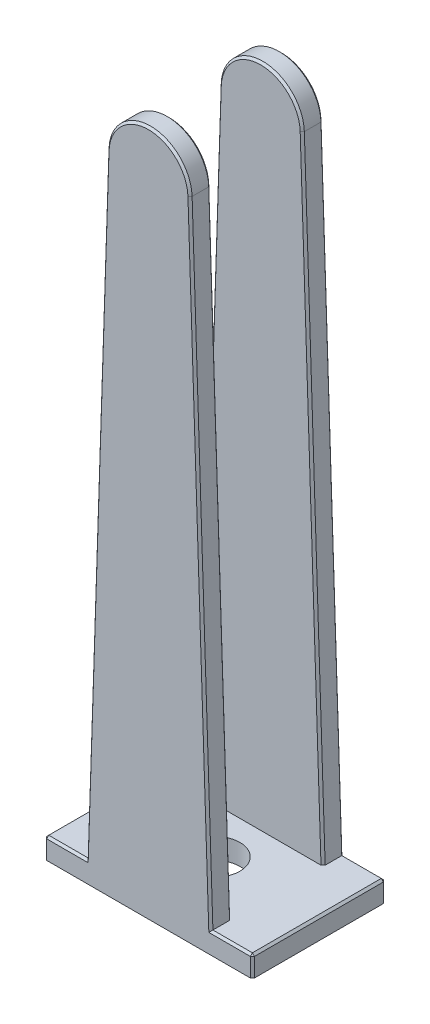
ISO-10303-21;
HEADER;
FILE_DESCRIPTION(('STEP AP214'),'2;1');
FILE_NAME('part.step','',(''),(''),'','','');
FILE_SCHEMA(('AUTOMOTIVE_DESIGN { 1 0 10303 214 1 1 1 1 }'));
ENDSEC;
DATA;
#1=APPLICATION_CONTEXT('core data for automotive mechanical design processes');
#2=APPLICATION_PROTOCOL_DEFINITION('international standard','automotive_design',2000,#1);
#3=PRODUCT_CONTEXT('',#1,'mechanical');
#4=PRODUCT('Part','Part','',(#3));
#5=PRODUCT_RELATED_PRODUCT_CATEGORY('part','',(#4));
#6=PRODUCT_DEFINITION_FORMATION('','',#4);
#7=PRODUCT_DEFINITION_CONTEXT('part definition',#1,'design');
#8=PRODUCT_DEFINITION('design','',#6,#7);
#9=PRODUCT_DEFINITION_SHAPE('','',#8);
#10=(LENGTH_UNIT() NAMED_UNIT(*) SI_UNIT(.MILLI.,.METRE.));
#11=(NAMED_UNIT(*) PLANE_ANGLE_UNIT() SI_UNIT($,.RADIAN.));
#12=(NAMED_UNIT(*) SI_UNIT($,.STERADIAN.) SOLID_ANGLE_UNIT());
#13=UNCERTAINTY_MEASURE_WITH_UNIT(LENGTH_MEASURE(1.E-05),#10,'distance_accuracy_value','');
#14=(GEOMETRIC_REPRESENTATION_CONTEXT(3) GLOBAL_UNCERTAINTY_ASSIGNED_CONTEXT((#13)) GLOBAL_UNIT_ASSIGNED_CONTEXT((#10,
#11,#12)) REPRESENTATION_CONTEXT('',''));
#15=CARTESIAN_POINT('',(0.,0.,0.));
#16=DIRECTION('',(0.,0.,1.));
#17=DIRECTION('',(1.,0.,0.));
#18=AXIS2_PLACEMENT_3D('',#15,#16,#17);
#19=CARTESIAN_POINT('',(0.,0.,0.));
#20=DIRECTION('',(0.,-1.,0.));
#21=DIRECTION('',(0.,0.,-1.));
#22=AXIS2_PLACEMENT_3D('',#19,#20,#21);
#23=PLANE('',#22);
#24=CARTESIAN_POINT('',(-15.,0.,16.));
#25=DIRECTION('',(0.,-1.,0.));
#26=DIRECTION('',(0.,0.,-1.));
#27=AXIS2_PLACEMENT_3D('',#24,#25,#26);
#28=CIRCLE('',#27,6.);
#29=CARTESIAN_POINT('',(-15.,0.,10.));
#30=VERTEX_POINT('',#29);
#31=EDGE_CURVE('E503',#30,#30,#28,.T.);
#32=ORIENTED_EDGE('',*,*,#31,.T.);
#33=EDGE_LOOP('',(#32));
#34=FACE_BOUND('',#33,.T.);
#35=DIRECTION('',(0.,0.,1.));
#36=VECTOR('',#35,1.);
#37=CARTESIAN_POINT('',(-39.5,0.,32.));
#38=LINE('',#37,#36);
#39=CARTESIAN_POINT('',(-39.5,0.,0.499999999999987));
#40=VERTEX_POINT('',#39);
#41=CARTESIAN_POINT('',(-39.5,0.,31.5));
#42=VERTEX_POINT('',#41);
#43=EDGE_CURVE('E275',#40,#42,#38,.T.);
#44=ORIENTED_EDGE('',*,*,#43,.T.);
#45=DIRECTION('',(1.,0.,0.));
#46=VECTOR('',#45,1.);
#47=CARTESIAN_POINT('',(-30.,0.,31.5));
#48=LINE('',#47,#46);
#49=CARTESIAN_POINT('',(-30.,0.,31.5));
#50=VERTEX_POINT('',#49);
#51=EDGE_CURVE('E278',#42,#50,#48,.T.);
#52=ORIENTED_EDGE('',*,*,#51,.T.);
#53=DIRECTION('',(0.,0.,1.));
#54=VECTOR('',#53,1.);
#55=CARTESIAN_POINT('',(-30.,0.,27.));
#56=LINE('',#55,#54);
#57=CARTESIAN_POINT('',(-30.,0.,27.5));
#58=VERTEX_POINT('',#57);
#59=EDGE_CURVE('E507',#58,#50,#56,.T.);
#60=ORIENTED_EDGE('',*,*,#59,.F.);
#61=DIRECTION('',(-0.707302628879884,0.,0.706910879234154));
#62=VECTOR('',#61,1.);
#63=CARTESIAN_POINT('',(-1.24169184557018,0.,-1.24237995542235));
#64=LINE('',#63,#62);
#65=CARTESIAN_POINT('',(-29.4997229144032,0.,27.));
#66=VERTEX_POINT('',#65);
#67=EDGE_CURVE('E51',#58,#66,#64,.F.);
#68=ORIENTED_EDGE('',*,*,#67,.T.);
#69=DIRECTION('',(1.,0.,0.));
#70=VECTOR('',#69,1.);
#71=CARTESIAN_POINT('',(0.,0.,27.));
#72=LINE('',#71,#70);
#73=CARTESIAN_POINT('',(-0.500277085596828,0.,27.));
#74=VERTEX_POINT('',#73);
#75=EDGE_CURVE('E496',#66,#74,#72,.T.);
#76=ORIENTED_EDGE('',*,*,#75,.T.);
#77=DIRECTION('',(-0.707302628879885,0.,-0.706910879234153));
#78=VECTOR('',#77,1.);
#79=CARTESIAN_POINT('',(-13.749997889818,0.,13.7576177425609));
#80=LINE('',#79,#78);
#81=CARTESIAN_POINT('',(0.,0.,27.5));
#82=VERTEX_POINT('',#81);
#83=EDGE_CURVE('E11',#74,#82,#80,.F.);
#84=ORIENTED_EDGE('',*,*,#83,.T.);
#85=DIRECTION('',(0.,0.,1.));
#86=VECTOR('',#85,1.);
#87=CARTESIAN_POINT('',(0.,0.,27.));
#88=LINE('',#87,#86);
#89=CARTESIAN_POINT('',(0.,0.,31.5));
#90=VERTEX_POINT('',#89);
#91=EDGE_CURVE('E502',#82,#90,#88,.T.);
#92=ORIENTED_EDGE('',*,*,#91,.T.);
#93=DIRECTION('',(1.,0.,0.));
#94=VECTOR('',#93,1.);
#95=CARTESIAN_POINT('',(10.,0.,31.5));
#96=LINE('',#95,#94);
#97=CARTESIAN_POINT('',(9.50000000000001,0.,31.5));
#98=VERTEX_POINT('',#97);
#99=EDGE_CURVE('E263',#90,#98,#96,.T.);
#100=ORIENTED_EDGE('',*,*,#99,.T.);
#101=DIRECTION('',(0.,0.,-1.));
#102=VECTOR('',#101,1.);
#103=CARTESIAN_POINT('',(9.50000000000001,0.,0.));
#104=LINE('',#103,#102);
#105=CARTESIAN_POINT('',(9.50000000000001,0.,0.499999999999993));
#106=VERTEX_POINT('',#105);
#107=EDGE_CURVE('E266',#98,#106,#104,.T.);
#108=ORIENTED_EDGE('',*,*,#107,.T.);
#109=DIRECTION('',(-1.,0.,0.));
#110=VECTOR('',#109,1.);
#111=CARTESIAN_POINT('',(0.,0.,0.499999999999993));
#112=LINE('',#111,#110);
#113=CARTESIAN_POINT('',(0.,0.,0.499999999999993));
#114=VERTEX_POINT('',#113);
#115=EDGE_CURVE('E269',#106,#114,#112,.T.);
#116=ORIENTED_EDGE('',*,*,#115,.T.);
#117=DIRECTION('',(0.,0.,-1.));
#118=VECTOR('',#117,1.);
#119=CARTESIAN_POINT('',(0.,0.,5.));
#120=LINE('',#119,#118);
#121=CARTESIAN_POINT('',(0.,0.,4.49999999999999));
#122=VERTEX_POINT('',#121);
#123=EDGE_CURVE('E526',#122,#114,#120,.T.);
#124=ORIENTED_EDGE('',*,*,#123,.F.);
#125=DIRECTION('',(0.707302628879885,0.,-0.706910879234153));
#126=VECTOR('',#125,1.);
#127=CARTESIAN_POINT('',(2.24999965469748,0.,2.25124653969178));
#128=LINE('',#127,#126);
#129=CARTESIAN_POINT('',(-0.500277085596828,0.,5.));
#130=VERTEX_POINT('',#129);
#131=EDGE_CURVE('E385',#122,#130,#128,.F.);
#132=ORIENTED_EDGE('',*,*,#131,.T.);
#133=DIRECTION('',(1.,0.,0.));
#134=VECTOR('',#133,1.);
#135=CARTESIAN_POINT('',(0.,0.,5.));
#136=LINE('',#135,#134);
#137=CARTESIAN_POINT('',(-29.4997229144032,0.,5.));
#138=VERTEX_POINT('',#137);
#139=EDGE_CURVE('E237',#138,#130,#136,.T.);
#140=ORIENTED_EDGE('',*,*,#139,.F.);
#141=DIRECTION('',(0.707302628879884,0.,0.706910879234154));
#142=VECTOR('',#141,1.);
#143=CARTESIAN_POINT('',(-17.2416893900856,0.,17.251244237675));
#144=LINE('',#143,#142);
#145=CARTESIAN_POINT('',(-30.,0.,4.49999999999999));
#146=VERTEX_POINT('',#145);
#147=EDGE_CURVE('E382',#138,#146,#144,.F.);
#148=ORIENTED_EDGE('',*,*,#147,.T.);
#149=DIRECTION('',(0.,0.,-1.));
#150=VECTOR('',#149,1.);
#151=CARTESIAN_POINT('',(-30.,0.,5.));
#152=LINE('',#151,#150);
#153=CARTESIAN_POINT('',(-30.,0.,0.499999999999993));
#154=VERTEX_POINT('',#153);
#155=EDGE_CURVE('E530',#146,#154,#152,.T.);
#156=ORIENTED_EDGE('',*,*,#155,.T.);
#157=DIRECTION('',(-1.,0.,0.));
#158=VECTOR('',#157,1.);
#159=CARTESIAN_POINT('',(-40.,0.,0.499999999999987));
#160=LINE('',#159,#158);
#161=EDGE_CURVE('E272',#154,#40,#160,.T.);
#162=ORIENTED_EDGE('',*,*,#161,.T.);
#163=EDGE_LOOP('',(#44,#52,#60,#68,#76,#84,#92,#100,#108,#116,#124,#132,#140,#148,#156,#162));
#164=FACE_BOUND('',#163,.T.);
#165=ADVANCED_FACE('F40',(#34,#164),#23,.F.);
#166=CARTESIAN_POINT('',(10.,-5.,0.));
#167=DIRECTION('',(1.,0.,0.));
#168=DIRECTION('',(0.,0.,-1.));
#169=AXIS2_PLACEMENT_3D('',#166,#167,#168);
#170=PLANE('',#169);
#171=DIRECTION('',(0.,0.,-1.));
#172=VECTOR('',#171,1.);
#173=CARTESIAN_POINT('',(10.,-5.,0.));
#174=LINE('',#173,#172);
#175=CARTESIAN_POINT('',(10.,-5.,31.5));
#176=VERTEX_POINT('',#175);
#177=CARTESIAN_POINT('',(10.,-5.,0.499999999999993));
#178=VERTEX_POINT('',#177);
#179=EDGE_CURVE('E222',#176,#178,#174,.T.);
#180=ORIENTED_EDGE('',*,*,#179,.T.);
#181=DIRECTION('',(0.,1.,0.));
#182=VECTOR('',#181,1.);
#183=CARTESIAN_POINT('',(10.,-5.,0.499999999999993));
#184=LINE('',#183,#182);
#185=CARTESIAN_POINT('',(10.,-0.5,0.499999999999993));
#186=VERTEX_POINT('',#185);
#187=EDGE_CURVE('E64',#178,#186,#184,.T.);
#188=ORIENTED_EDGE('',*,*,#187,.T.);
#189=DIRECTION('',(0.,0.,1.));
#190=VECTOR('',#189,1.);
#191=CARTESIAN_POINT('',(10.,-0.5,32.));
#192=LINE('',#191,#190);
#193=CARTESIAN_POINT('',(10.,-0.5,31.5));
#194=VERTEX_POINT('',#193);
#195=EDGE_CURVE('E59',#186,#194,#192,.T.);
#196=ORIENTED_EDGE('',*,*,#195,.T.);
#197=DIRECTION('',(0.,-1.,0.));
#198=VECTOR('',#197,1.);
#199=CARTESIAN_POINT('',(10.,-5.,31.5));
#200=LINE('',#199,#198);
#201=EDGE_CURVE('E377',#194,#176,#200,.T.);
#202=ORIENTED_EDGE('',*,*,#201,.T.);
#203=EDGE_LOOP('',(#180,#188,#196,#202));
#204=FACE_BOUND('',#203,.T.);
#205=ADVANCED_FACE('F632',(#204),#170,.T.);
#206=CARTESIAN_POINT('',(-40.,-5.,0.));
#207=DIRECTION('',(-1.,0.,0.));
#208=DIRECTION('',(0.,0.,1.));
#209=AXIS2_PLACEMENT_3D('',#206,#207,#208);
#210=PLANE('',#209);
#211=DIRECTION('',(0.,0.,1.));
#212=VECTOR('',#211,1.);
#213=CARTESIAN_POINT('',(-40.,-5.,0.));
#214=LINE('',#213,#212);
#215=CARTESIAN_POINT('',(-40.,-5.,0.499999999999987));
#216=VERTEX_POINT('',#215);
#217=CARTESIAN_POINT('',(-40.,-5.,31.5));
#218=VERTEX_POINT('',#217);
#219=EDGE_CURVE('E546',#216,#218,#214,.T.);
#220=ORIENTED_EDGE('',*,*,#219,.T.);
#221=DIRECTION('',(0.,1.,0.));
#222=VECTOR('',#221,1.);
#223=CARTESIAN_POINT('',(-40.,-5.,31.5));
#224=LINE('',#223,#222);
#225=CARTESIAN_POINT('',(-40.,-0.5,31.5));
#226=VERTEX_POINT('',#225);
#227=EDGE_CURVE('E227',#218,#226,#224,.T.);
#228=ORIENTED_EDGE('',*,*,#227,.T.);
#229=DIRECTION('',(0.,0.,-1.));
#230=VECTOR('',#229,1.);
#231=CARTESIAN_POINT('',(-40.,-0.5,0.));
#232=LINE('',#231,#230);
#233=CARTESIAN_POINT('',(-40.,-0.5,0.499999999999987));
#234=VERTEX_POINT('',#233);
#235=EDGE_CURVE('E285',#226,#234,#232,.T.);
#236=ORIENTED_EDGE('',*,*,#235,.T.);
#237=DIRECTION('',(0.,-1.,0.));
#238=VECTOR('',#237,1.);
#239=CARTESIAN_POINT('',(-40.,-5.,0.499999999999987));
#240=LINE('',#239,#238);
#241=EDGE_CURVE('E282',#234,#216,#240,.T.);
#242=ORIENTED_EDGE('',*,*,#241,.T.);
#243=EDGE_LOOP('',(#220,#228,#236,#242));
#244=FACE_BOUND('',#243,.T.);
#245=ADVANCED_FACE('F584',(#244),#210,.T.);
#246=CARTESIAN_POINT('',(0.,-5.,0.));
#247=DIRECTION('',(0.,0.,-1.));
#248=DIRECTION('',(-1.,0.,0.));
#249=AXIS2_PLACEMENT_3D('',#246,#247,#248);
#250=PLANE('',#249);
#251=DIRECTION('',(-1.,0.,0.));
#252=VECTOR('',#251,1.);
#253=CARTESIAN_POINT('',(0.,-5.,0.));
#254=LINE('',#253,#252);
#255=CARTESIAN_POINT('',(9.5,-5.,0.));
#256=VERTEX_POINT('',#255);
#257=CARTESIAN_POINT('',(-39.5,-5.,0.));
#258=VERTEX_POINT('',#257);
#259=EDGE_CURVE('E542',#256,#258,#254,.T.);
#260=ORIENTED_EDGE('',*,*,#259,.T.);
#261=DIRECTION('',(0.,1.,0.));
#262=VECTOR('',#261,1.);
#263=CARTESIAN_POINT('',(-39.5,-5.,0.));
#264=LINE('',#263,#262);
#265=CARTESIAN_POINT('',(-39.5,-0.5,0.));
#266=VERTEX_POINT('',#265);
#267=EDGE_CURVE('E316',#258,#266,#264,.T.);
#268=ORIENTED_EDGE('',*,*,#267,.T.);
#269=DIRECTION('',(1.,0.,0.));
#270=VECTOR('',#269,1.);
#271=CARTESIAN_POINT('',(-30.,-0.5,0.));
#272=LINE('',#271,#270);
#273=CARTESIAN_POINT('',(-29.5163711086967,-0.5,0.));
#274=VERTEX_POINT('',#273);
#275=EDGE_CURVE('E313',#266,#274,#272,.T.);
#276=ORIENTED_EDGE('',*,*,#275,.T.);
#277=DIRECTION('',(0.0332779469075335,0.999446135742002,0.));
#278=VECTOR('',#277,1.);
#279=CARTESIAN_POINT('',(-24.494738289549,150.316140495622,0.));
#280=LINE('',#279,#278);
#281=CARTESIAN_POINT('',(-24.494738289549,150.316140495622,0.));
#282=VERTEX_POINT('',#281);
#283=EDGE_CURVE('E310',#274,#282,#280,.T.);
#284=ORIENTED_EDGE('',*,*,#283,.T.);
#285=CARTESIAN_POINT('',(-15.,150.,0.));
#286=DIRECTION('',(0.,0.,-1.));
#287=DIRECTION('',(-1.,0.,0.));
#288=AXIS2_PLACEMENT_3D('',#285,#286,#287);
#289=CIRCLE('',#288,9.5);
#290=CARTESIAN_POINT('',(-5.50526171045098,150.316140495622,0.));
#291=VERTEX_POINT('',#290);
#292=EDGE_CURVE('E307',#282,#291,#289,.T.);
#293=ORIENTED_EDGE('',*,*,#292,.T.);
#294=DIRECTION('',(0.0332779469075335,-0.999446135742002,0.));
#295=VECTOR('',#294,1.);
#296=CARTESIAN_POINT('',(-0.499723067871002,-0.0166389734537668,0.));
#297=LINE('',#296,#295);
#298=CARTESIAN_POINT('',(-0.483628891303263,-0.5,0.));
#299=VERTEX_POINT('',#298);
#300=EDGE_CURVE('E301',#291,#299,#297,.T.);
#301=ORIENTED_EDGE('',*,*,#300,.T.);
#302=DIRECTION('',(1.,0.,0.));
#303=VECTOR('',#302,1.);
#304=CARTESIAN_POINT('',(10.,-0.5,0.));
#305=LINE('',#304,#303);
#306=CARTESIAN_POINT('',(9.5,-0.5,0.));
#307=VERTEX_POINT('',#306);
#308=EDGE_CURVE('E298',#299,#307,#305,.T.);
#309=ORIENTED_EDGE('',*,*,#308,.T.);
#310=DIRECTION('',(0.,-1.,0.));
#311=VECTOR('',#310,1.);
#312=CARTESIAN_POINT('',(9.5,-5.,0.));
#313=LINE('',#312,#311);
#314=EDGE_CURVE('E304',#307,#256,#313,.T.);
#315=ORIENTED_EDGE('',*,*,#314,.T.);
#316=EDGE_LOOP('',(#260,#268,#276,#284,#293,#301,#309,#315));
#317=FACE_BOUND('',#316,.T.);
#318=ADVANCED_FACE('F606',(#317),#250,.T.);
#319=CARTESIAN_POINT('',(0.,-5.,0.));
#320=DIRECTION('',(0.,-1.,0.));
#321=DIRECTION('',(0.,0.,-1.));
#322=AXIS2_PLACEMENT_3D('',#319,#320,#321);
#323=PLANE('',#322);
#324=CARTESIAN_POINT('',(-15.,-5.,16.));
#325=DIRECTION('',(0.,-1.,0.));
#326=DIRECTION('',(0.,0.,-1.));
#327=AXIS2_PLACEMENT_3D('',#324,#325,#326);
#328=CIRCLE('',#327,6.);
#329=CARTESIAN_POINT('',(-15.,-5.,10.));
#330=VERTEX_POINT('',#329);
#331=EDGE_CURVE('E467',#330,#330,#328,.T.);
#332=ORIENTED_EDGE('',*,*,#331,.F.);
#333=EDGE_LOOP('',(#332));
#334=FACE_BOUND('',#333,.T.);
#335=DIRECTION('',(-1.,0.,0.));
#336=VECTOR('',#335,1.);
#337=CARTESIAN_POINT('',(0.,-5.,32.));
#338=LINE('',#337,#336);
#339=CARTESIAN_POINT('',(9.50000000000001,-5.,32.));
#340=VERTEX_POINT('',#339);
#341=CARTESIAN_POINT('',(-39.5,-5.,32.));
#342=VERTEX_POINT('',#341);
#343=EDGE_CURVE('E220',#340,#342,#338,.T.);
#344=ORIENTED_EDGE('',*,*,#343,.T.);
#345=DIRECTION('',(0.707106781186557,0.,0.707106781186538));
#346=VECTOR('',#345,1.);
#347=CARTESIAN_POINT('',(-35.7499999999995,-5.,35.7500000000005));
#348=LINE('',#347,#346);
#349=EDGE_CURVE('E295',#342,#218,#348,.F.);
#350=ORIENTED_EDGE('',*,*,#349,.T.);
#351=ORIENTED_EDGE('',*,*,#219,.F.);
#352=DIRECTION('',(-0.707106781186557,0.,0.707106781186538));
#353=VECTOR('',#352,1.);
#354=CARTESIAN_POINT('',(-19.7499999999994,-5.,-19.75));
#355=LINE('',#354,#353);
#356=EDGE_CURVE('E292',#216,#258,#355,.F.);
#357=ORIENTED_EDGE('',*,*,#356,.T.);
#358=ORIENTED_EDGE('',*,*,#259,.F.);
#359=DIRECTION('',(-0.707106781186553,0.,-0.707106781186542));
#360=VECTOR('',#359,1.);
#361=CARTESIAN_POINT('',(4.74999999999993,-5.,-4.75));
#362=LINE('',#361,#360);
#363=EDGE_CURVE('E226',#256,#178,#362,.F.);
#364=ORIENTED_EDGE('',*,*,#363,.T.);
#365=ORIENTED_EDGE('',*,*,#179,.F.);
#366=DIRECTION('',(0.707106781186543,0.,-0.707106781186552));
#367=VECTOR('',#366,1.);
#368=CARTESIAN_POINT('',(20.7500000000001,-5.,20.7499999999998));
#369=LINE('',#368,#367);
#370=EDGE_CURVE('E217',#176,#340,#369,.F.);
#371=ORIENTED_EDGE('',*,*,#370,.T.);
#372=EDGE_LOOP('',(#344,#350,#351,#357,#358,#364,#365,#371));
#373=FACE_BOUND('',#372,.T.);
#374=ADVANCED_FACE('F219',(#334,#373),#323,.T.);
#375=CARTESIAN_POINT('',(-5.00553864257998,150.332779469075,5.));
#376=DIRECTION('',(-0.999446135742002,-0.0332779469075335,0.));
#377=DIRECTION('',(0.0332779469075335,-0.999446135742002,0.));
#378=AXIS2_PLACEMENT_3D('',#375,#376,#377);
#379=PLANE('',#378);
#380=DIRECTION('',(0.,0.,-1.));
#381=VECTOR('',#380,1.);
#382=CARTESIAN_POINT('',(-5.00553864257998,150.332779469075,5.));
#383=LINE('',#382,#381);
#384=CARTESIAN_POINT('',(-5.00553864257998,150.332779469075,4.49999999999999));
#385=VERTEX_POINT('',#384);
#386=CARTESIAN_POINT('',(-5.00553864257998,150.332779469075,0.499999999999993));
#387=VERTEX_POINT('',#386);
#388=EDGE_CURVE('E538',#385,#387,#383,.T.);
#389=ORIENTED_EDGE('',*,*,#388,.F.);
#390=DIRECTION('',(0.0332779469075335,-0.999446135742002,0.));
#391=VECTOR('',#390,1.);
#392=CARTESIAN_POINT('',(-5.00553864257998,150.332779469075,4.49999999999999));
#393=LINE('',#392,#391);
#394=EDGE_CURVE('E344',#385,#122,#393,.T.);
#395=ORIENTED_EDGE('',*,*,#394,.T.);
#396=ORIENTED_EDGE('',*,*,#123,.T.);
#397=DIRECTION('',(-0.0332779469075335,0.999446135742002,0.));
#398=VECTOR('',#397,1.);
#399=CARTESIAN_POINT('',(-5.00553864257998,150.332779469075,0.499999999999993));
#400=LINE('',#399,#398);
#401=EDGE_CURVE('E341',#114,#387,#400,.T.);
#402=ORIENTED_EDGE('',*,*,#401,.T.);
#403=EDGE_LOOP('',(#389,#395,#396,#402));
#404=FACE_BOUND('',#403,.T.);
#405=ADVANCED_FACE('F817',(#404),#379,.F.);
#406=CARTESIAN_POINT('',(-15.,150.,5.));
#407=DIRECTION('',(0.,0.,-1.));
#408=DIRECTION('',(-1.,0.,0.));
#409=AXIS2_PLACEMENT_3D('',#406,#407,#408);
#410=CYLINDRICAL_SURFACE('',#409,10.);
#411=DIRECTION('',(0.,0.,-1.));
#412=VECTOR('',#411,1.);
#413=CARTESIAN_POINT('',(-24.99446135742,150.332779469075,5.));
#414=LINE('',#413,#412);
#415=CARTESIAN_POINT('',(-24.99446135742,150.332779469075,4.49999999999999));
#416=VERTEX_POINT('',#415);
#417=CARTESIAN_POINT('',(-24.99446135742,150.332779469075,0.499999999999993));
#418=VERTEX_POINT('',#417);
#419=EDGE_CURVE('E534',#416,#418,#414,.T.);
#420=ORIENTED_EDGE('',*,*,#419,.F.);
#421=CARTESIAN_POINT('',(-15.,150.,4.49999999999999));
#422=DIRECTION('',(0.,0.,-1.));
#423=DIRECTION('',(-1.,0.,0.));
#424=AXIS2_PLACEMENT_3D('',#421,#422,#423);
#425=CIRCLE('',#424,10.);
#426=EDGE_CURVE('E338',#416,#385,#425,.T.);
#427=ORIENTED_EDGE('',*,*,#426,.T.);
#428=ORIENTED_EDGE('',*,*,#388,.T.);
#429=CARTESIAN_POINT('',(-15.,150.,0.499999999999993));
#430=DIRECTION('',(0.,0.,-1.));
#431=DIRECTION('',(-1.,0.,0.));
#432=AXIS2_PLACEMENT_3D('',#429,#430,#431);
#433=CIRCLE('',#432,10.);
#434=EDGE_CURVE('E335',#387,#418,#433,.F.);
#435=ORIENTED_EDGE('',*,*,#434,.T.);
#436=EDGE_LOOP('',(#420,#427,#428,#435));
#437=FACE_BOUND('',#436,.T.);
#438=ADVANCED_FACE('F814',(#437),#410,.T.);
#439=CARTESIAN_POINT('',(-24.99446135742,150.332779469075,5.));
#440=DIRECTION('',(0.999446135742002,-0.0332779469075335,0.));
#441=DIRECTION('',(0.0332779469075335,0.999446135742002,0.));
#442=AXIS2_PLACEMENT_3D('',#439,#440,#441);
#443=PLANE('',#442);
#444=ORIENTED_EDGE('',*,*,#155,.F.);
#445=DIRECTION('',(0.0332779469075335,0.999446135742002,0.));
#446=VECTOR('',#445,1.);
#447=CARTESIAN_POINT('',(-24.99446135742,150.332779469075,4.49999999999999));
#448=LINE('',#447,#446);
#449=EDGE_CURVE('E332',#146,#416,#448,.T.);
#450=ORIENTED_EDGE('',*,*,#449,.T.);
#451=ORIENTED_EDGE('',*,*,#419,.T.);
#452=DIRECTION('',(-0.0332779469075335,-0.999446135742002,0.));
#453=VECTOR('',#452,1.);
#454=CARTESIAN_POINT('',(-30.,0.,0.499999999999993));
#455=LINE('',#454,#453);
#456=EDGE_CURVE('E329',#418,#154,#455,.T.);
#457=ORIENTED_EDGE('',*,*,#456,.T.);
#458=EDGE_LOOP('',(#444,#450,#451,#457));
#459=FACE_BOUND('',#458,.T.);
#460=ADVANCED_FACE('F810',(#459),#443,.F.);
#461=CARTESIAN_POINT('',(-15.,150.,5.));
#462=DIRECTION('',(0.,0.,-1.));
#463=DIRECTION('',(-1.,0.,0.));
#464=AXIS2_PLACEMENT_3D('',#461,#462,#463);
#465=PLANE('',#464);
#466=CARTESIAN_POINT('',(-15.,150.,5.));
#467=DIRECTION('',(0.,0.,-1.));
#468=DIRECTION('',(-1.,0.,0.));
#469=AXIS2_PLACEMENT_3D('',#466,#467,#468);
#470=CIRCLE('',#469,9.49999999999998);
#471=CARTESIAN_POINT('',(-5.505261710451,150.316140495622,5.));
#472=VERTEX_POINT('',#471);
#473=CARTESIAN_POINT('',(-24.494738289549,150.316140495622,5.));
#474=VERTEX_POINT('',#473);
#475=EDGE_CURVE('E322',#472,#474,#470,.F.);
#476=ORIENTED_EDGE('',*,*,#475,.T.);
#477=DIRECTION('',(-0.0332779469075335,-0.999446135742002,0.));
#478=VECTOR('',#477,1.);
#479=CARTESIAN_POINT('',(-24.494738289549,150.316140495622,5.));
#480=LINE('',#479,#478);
#481=EDGE_CURVE('E325',#474,#138,#480,.T.);
#482=ORIENTED_EDGE('',*,*,#481,.T.);
#483=ORIENTED_EDGE('',*,*,#139,.T.);
#484=DIRECTION('',(-0.0332779469075335,0.999446135742002,0.));
#485=VECTOR('',#484,1.);
#486=CARTESIAN_POINT('',(-5.505261710451,150.316140495622,5.));
#487=LINE('',#486,#485);
#488=EDGE_CURVE('E319',#130,#472,#487,.T.);
#489=ORIENTED_EDGE('',*,*,#488,.T.);
#490=EDGE_LOOP('',(#476,#482,#483,#489));
#491=FACE_BOUND('',#490,.T.);
#492=ADVANCED_FACE('F804',(#491),#465,.F.);
#493=CARTESIAN_POINT('',(0.,-5.,32.));
#494=DIRECTION('',(0.,0.,1.));
#495=DIRECTION('',(-1.,0.,0.));
#496=AXIS2_PLACEMENT_3D('',#493,#494,#495);
#497=PLANE('',#496);
#498=DIRECTION('',(-1.,0.,0.));
#499=VECTOR('',#498,1.);
#500=CARTESIAN_POINT('',(-40.,-0.5,32.));
#501=LINE('',#500,#499);
#502=CARTESIAN_POINT('',(-29.5163711086967,-0.5,32.));
#503=VERTEX_POINT('',#502);
#504=CARTESIAN_POINT('',(-39.5,-0.5,32.));
#505=VERTEX_POINT('',#504);
#506=EDGE_CURVE('E258',#503,#505,#501,.T.);
#507=ORIENTED_EDGE('',*,*,#506,.T.);
#508=DIRECTION('',(0.,-1.,0.));
#509=VECTOR('',#508,1.);
#510=CARTESIAN_POINT('',(-39.5,-5.,32.));
#511=LINE('',#510,#509);
#512=EDGE_CURVE('E235',#505,#342,#511,.T.);
#513=ORIENTED_EDGE('',*,*,#512,.T.);
#514=ORIENTED_EDGE('',*,*,#343,.F.);
#515=DIRECTION('',(0.,1.,0.));
#516=VECTOR('',#515,1.);
#517=CARTESIAN_POINT('',(9.50000000000001,-5.,32.));
#518=LINE('',#517,#516);
#519=CARTESIAN_POINT('',(9.50000000000001,-0.499999999999993,32.));
#520=VERTEX_POINT('',#519);
#521=EDGE_CURVE('E232',#340,#520,#518,.T.);
#522=ORIENTED_EDGE('',*,*,#521,.T.);
#523=DIRECTION('',(-1.,0.,0.));
#524=VECTOR('',#523,1.);
#525=CARTESIAN_POINT('',(0.,-0.499999999999993,32.));
#526=LINE('',#525,#524);
#527=CARTESIAN_POINT('',(-0.483628891303254,-0.499999999999993,32.));
#528=VERTEX_POINT('',#527);
#529=EDGE_CURVE('E246',#520,#528,#526,.T.);
#530=ORIENTED_EDGE('',*,*,#529,.T.);
#531=DIRECTION('',(-0.0332779469075335,0.999446135742002,0.));
#532=VECTOR('',#531,1.);
#533=CARTESIAN_POINT('',(-5.50526171045098,150.316140495622,32.));
#534=LINE('',#533,#532);
#535=CARTESIAN_POINT('',(-5.50526171045098,150.316140495622,32.));
#536=VERTEX_POINT('',#535);
#537=EDGE_CURVE('E252',#528,#536,#534,.T.);
#538=ORIENTED_EDGE('',*,*,#537,.T.);
#539=CARTESIAN_POINT('',(-15.,150.,32.));
#540=DIRECTION('',(0.,0.,1.));
#541=DIRECTION('',(1.,0.,0.));
#542=AXIS2_PLACEMENT_3D('',#539,#540,#541);
#543=CIRCLE('',#542,9.50000000000001);
#544=CARTESIAN_POINT('',(-24.494738289549,150.316140495622,32.));
#545=VERTEX_POINT('',#544);
#546=EDGE_CURVE('E245',#536,#545,#543,.T.);
#547=ORIENTED_EDGE('',*,*,#546,.T.);
#548=DIRECTION('',(-0.0332779469075335,-0.999446135742002,0.));
#549=VECTOR('',#548,1.);
#550=CARTESIAN_POINT('',(-29.500276932129,-0.0166389734537666,32.));
#551=LINE('',#550,#549);
#552=EDGE_CURVE('E250',#545,#503,#551,.T.);
#553=ORIENTED_EDGE('',*,*,#552,.T.);
#554=EDGE_LOOP('',(#507,#513,#514,#522,#530,#538,#547,#553));
#555=FACE_BOUND('',#554,.T.);
#556=ADVANCED_FACE('F231',(#555),#497,.T.);
#557=CARTESIAN_POINT('',(-5.00553864257998,150.332779469075,27.));
#558=DIRECTION('',(-0.999446135742002,-0.0332779469075335,0.));
#559=DIRECTION('',(0.0332779469075335,-0.999446135742002,0.));
#560=AXIS2_PLACEMENT_3D('',#557,#558,#559);
#561=PLANE('',#560);
#562=ORIENTED_EDGE('',*,*,#91,.F.);
#563=DIRECTION('',(-0.0332779469075335,0.999446135742002,0.));
#564=VECTOR('',#563,1.);
#565=CARTESIAN_POINT('',(-5.00553864257998,150.332779469075,27.5));
#566=LINE('',#565,#564);
#567=CARTESIAN_POINT('',(-5.00553864257998,150.332779469075,27.5));
#568=VERTEX_POINT('',#567);
#569=EDGE_CURVE('E372',#82,#568,#566,.T.);
#570=ORIENTED_EDGE('',*,*,#569,.T.);
#571=DIRECTION('',(0.,0.,1.));
#572=VECTOR('',#571,1.);
#573=CARTESIAN_POINT('',(-5.00553864257998,150.332779469075,27.));
#574=LINE('',#573,#572);
#575=CARTESIAN_POINT('',(-5.00553864257998,150.332779469075,31.5));
#576=VERTEX_POINT('',#575);
#577=EDGE_CURVE('E238',#568,#576,#574,.T.);
#578=ORIENTED_EDGE('',*,*,#577,.T.);
#579=DIRECTION('',(0.0332779469075335,-0.999446135742002,0.));
#580=VECTOR('',#579,1.);
#581=CARTESIAN_POINT('',(0.,0.,31.5));
#582=LINE('',#581,#580);
#583=EDGE_CURVE('E369',#576,#90,#582,.T.);
#584=ORIENTED_EDGE('',*,*,#583,.T.);
#585=EDGE_LOOP('',(#562,#570,#578,#584));
#586=FACE_BOUND('',#585,.T.);
#587=ADVANCED_FACE('F643',(#586),#561,.F.);
#588=CARTESIAN_POINT('',(-15.,150.,27.));
#589=DIRECTION('',(0.,0.,1.));
#590=DIRECTION('',(-1.,0.,0.));
#591=AXIS2_PLACEMENT_3D('',#588,#589,#590);
#592=CYLINDRICAL_SURFACE('',#591,10.);
#593=ORIENTED_EDGE('',*,*,#577,.F.);
#594=CARTESIAN_POINT('',(-15.,150.,27.5));
#595=DIRECTION('',(0.,0.,1.));
#596=DIRECTION('',(1.,0.,0.));
#597=AXIS2_PLACEMENT_3D('',#594,#595,#596);
#598=CIRCLE('',#597,10.);
#599=CARTESIAN_POINT('',(-24.99446135742,150.332779469075,27.5));
#600=VERTEX_POINT('',#599);
#601=EDGE_CURVE('E366',#568,#600,#598,.T.);
#602=ORIENTED_EDGE('',*,*,#601,.T.);
#603=DIRECTION('',(0.,0.,1.));
#604=VECTOR('',#603,1.);
#605=CARTESIAN_POINT('',(-24.99446135742,150.332779469075,27.));
#606=LINE('',#605,#604);
#607=CARTESIAN_POINT('',(-24.99446135742,150.332779469075,31.5));
#608=VERTEX_POINT('',#607);
#609=EDGE_CURVE('E516',#600,#608,#606,.T.);
#610=ORIENTED_EDGE('',*,*,#609,.T.);
#611=CARTESIAN_POINT('',(-15.,150.,31.5));
#612=DIRECTION('',(0.,0.,1.));
#613=DIRECTION('',(1.,0.,0.));
#614=AXIS2_PLACEMENT_3D('',#611,#612,#613);
#615=CIRCLE('',#614,10.);
#616=EDGE_CURVE('E363',#608,#576,#615,.F.);
#617=ORIENTED_EDGE('',*,*,#616,.T.);
#618=EDGE_LOOP('',(#593,#602,#610,#617));
#619=FACE_BOUND('',#618,.T.);
#620=ADVANCED_FACE('F646',(#619),#592,.T.);
#621=CARTESIAN_POINT('',(-24.99446135742,150.332779469075,27.));
#622=DIRECTION('',(0.999446135742002,-0.0332779469075335,0.));
#623=DIRECTION('',(0.0332779469075335,0.999446135742002,0.));
#624=AXIS2_PLACEMENT_3D('',#621,#622,#623);
#625=PLANE('',#624);
#626=ORIENTED_EDGE('',*,*,#609,.F.);
#627=DIRECTION('',(-0.0332779469075335,-0.999446135742002,0.));
#628=VECTOR('',#627,1.);
#629=CARTESIAN_POINT('',(-24.99446135742,150.332779469075,27.5));
#630=LINE('',#629,#628);
#631=EDGE_CURVE('E350',#600,#58,#630,.T.);
#632=ORIENTED_EDGE('',*,*,#631,.T.);
#633=ORIENTED_EDGE('',*,*,#59,.T.);
#634=DIRECTION('',(0.0332779469075335,0.999446135742002,0.));
#635=VECTOR('',#634,1.);
#636=CARTESIAN_POINT('',(-24.99446135742,150.332779469075,31.5));
#637=LINE('',#636,#635);
#638=EDGE_CURVE('E347',#50,#608,#637,.T.);
#639=ORIENTED_EDGE('',*,*,#638,.T.);
#640=EDGE_LOOP('',(#626,#632,#633,#639));
#641=FACE_BOUND('',#640,.T.);
#642=ADVANCED_FACE('F649',(#641),#625,.F.);
#643=CARTESIAN_POINT('',(-15.,150.,27.));
#644=DIRECTION('',(0.,0.,1.));
#645=DIRECTION('',(-1.,0.,0.));
#646=AXIS2_PLACEMENT_3D('',#643,#644,#645);
#647=PLANE('',#646);
#648=ORIENTED_EDGE('',*,*,#75,.F.);
#649=DIRECTION('',(0.0332779469075335,0.999446135742002,0.));
#650=VECTOR('',#649,1.);
#651=CARTESIAN_POINT('',(-24.494738289549,150.316140495622,27.));
#652=LINE('',#651,#650);
#653=CARTESIAN_POINT('',(-24.494738289549,150.316140495622,27.));
#654=VERTEX_POINT('',#653);
#655=EDGE_CURVE('E360',#66,#654,#652,.T.);
#656=ORIENTED_EDGE('',*,*,#655,.T.);
#657=CARTESIAN_POINT('',(-15.,150.,27.));
#658=DIRECTION('',(0.,0.,1.));
#659=DIRECTION('',(1.,0.,0.));
#660=AXIS2_PLACEMENT_3D('',#657,#658,#659);
#661=CIRCLE('',#660,9.49999999999998);
#662=CARTESIAN_POINT('',(-5.505261710451,150.316140495622,27.));
#663=VERTEX_POINT('',#662);
#664=EDGE_CURVE('E357',#654,#663,#661,.F.);
#665=ORIENTED_EDGE('',*,*,#664,.T.);
#666=DIRECTION('',(0.0332779469075335,-0.999446135742002,0.));
#667=VECTOR('',#666,1.);
#668=CARTESIAN_POINT('',(-5.505261710451,150.316140495622,27.));
#669=LINE('',#668,#667);
#670=EDGE_CURVE('E354',#663,#74,#669,.T.);
#671=ORIENTED_EDGE('',*,*,#670,.T.);
#672=EDGE_LOOP('',(#648,#656,#665,#671));
#673=FACE_BOUND('',#672,.T.);
#674=ADVANCED_FACE('F495',(#673),#647,.F.);
#675=CARTESIAN_POINT('',(-15.,160.,16.));
#676=DIRECTION('',(0.,-1.,0.));
#677=DIRECTION('',(0.,0.,-1.));
#678=AXIS2_PLACEMENT_3D('',#675,#676,#677);
#679=CYLINDRICAL_SURFACE('',#678,6.);
#680=ORIENTED_EDGE('',*,*,#331,.T.);
#681=EDGE_LOOP('',(#680));
#682=FACE_BOUND('',#681,.T.);
#683=ORIENTED_EDGE('',*,*,#31,.F.);
#684=EDGE_LOOP('',(#683));
#685=FACE_BOUND('',#684,.T.);
#686=ADVANCED_FACE('F777',(#682,#685),#679,.F.);
#687=CARTESIAN_POINT('',(10.,-5.,0.499999999999993));
#688=DIRECTION('',(-0.707106781186542,0.,0.707106781186553));
#689=DIRECTION('',(0.,1.,0.));
#690=AXIS2_PLACEMENT_3D('',#687,#688,#689);
#691=PLANE('',#690);
#692=ORIENTED_EDGE('',*,*,#363,.F.);
#693=ORIENTED_EDGE('',*,*,#314,.F.);
#694=DIRECTION('',(0.707106781186553,0.,0.707106781186542));
#695=VECTOR('',#694,1.);
#696=CARTESIAN_POINT('',(10.,-0.5,0.499999999999993));
#697=LINE('',#696,#695);
#698=EDGE_CURVE('E459',#186,#307,#697,.F.);
#699=ORIENTED_EDGE('',*,*,#698,.F.);
#700=ORIENTED_EDGE('',*,*,#187,.F.);
#701=EDGE_LOOP('',(#692,#693,#699,#700));
#702=FACE_BOUND('',#701,.T.);
#703=ADVANCED_FACE('F630',(#702),#691,.F.);
#704=CARTESIAN_POINT('',(0.,0.,0.499999999999993));
#705=DIRECTION('',(0.,0.707106781186542,-0.707106781186553));
#706=DIRECTION('',(1.,0.,0.));
#707=AXIS2_PLACEMENT_3D('',#704,#705,#706);
#708=PLANE('',#707);
#709=DIRECTION('',(0.,0.707106781186553,0.707106781186542));
#710=VECTOR('',#709,1.);
#711=CARTESIAN_POINT('',(9.5,-0.25,0.249999999999996));
#712=LINE('',#711,#710);
#713=EDGE_CURVE('E463',#307,#106,#712,.T.);
#714=ORIENTED_EDGE('',*,*,#713,.F.);
#715=ORIENTED_EDGE('',*,*,#308,.F.);
#716=DIRECTION('',(0.564539987306202,0.58364998189511,0.583649981895101));
#717=VECTOR('',#716,1.);
#718=CARTESIAN_POINT('',(47.9384195802375,49.5611619180309,50.0611619180302));
#719=LINE('',#718,#717);
#720=EDGE_CURVE('E455',#114,#299,#719,.F.);
#721=ORIENTED_EDGE('',*,*,#720,.F.);
#722=ORIENTED_EDGE('',*,*,#115,.F.);
#723=EDGE_LOOP('',(#714,#715,#721,#722));
#724=FACE_BOUND('',#723,.T.);
#725=ADVANCED_FACE('F625',(#724),#708,.T.);
#726=CARTESIAN_POINT('',(10.,-0.5,0.499999999999993));
#727=DIRECTION('',(0.577350269189626,0.577350269189618,-0.577350269189634));
#728=DIRECTION('',(-0.707106781186553,0.,-0.707106781186542));
#729=AXIS2_PLACEMENT_3D('',#726,#727,#728);
#730=PLANE('',#729);
#731=ORIENTED_EDGE('',*,*,#698,.T.);
#732=ORIENTED_EDGE('',*,*,#713,.T.);
#733=DIRECTION('',(0.707106781186543,-0.707106781186552,0.));
#734=VECTOR('',#733,1.);
#735=CARTESIAN_POINT('',(10.,-0.5,0.499999999999993));
#736=LINE('',#735,#734);
#737=EDGE_CURVE('E451',#186,#106,#736,.F.);
#738=ORIENTED_EDGE('',*,*,#737,.F.);
#739=EDGE_LOOP('',(#731,#732,#738));
#740=FACE_BOUND('',#739,.T.);
#741=ADVANCED_FACE('F761',(#740),#730,.T.);
#742=CARTESIAN_POINT('',(-5.00553864257998,150.332779469075,0.499999999999993));
#743=DIRECTION('',(0.706715140013854,0.0235310619222826,-0.707106781186553));
#744=DIRECTION('',(0.0332779469075335,-0.999446135742002,0.));
#745=AXIS2_PLACEMENT_3D('',#742,#743,#744);
#746=PLANE('',#745);
#747=ORIENTED_EDGE('',*,*,#720,.T.);
#748=ORIENTED_EDGE('',*,*,#300,.F.);
#749=DIRECTION('',(-0.706715140013865,-0.0235310619222951,-0.707106781186542));
#750=VECTOR('',#749,1.);
#751=CARTESIAN_POINT('',(-5.00553864257998,150.332779469075,0.499999999999993));
#752=LINE('',#751,#750);
#753=EDGE_CURVE('E447',#387,#291,#752,.T.);
#754=ORIENTED_EDGE('',*,*,#753,.F.);
#755=ORIENTED_EDGE('',*,*,#401,.F.);
#756=EDGE_LOOP('',(#747,#748,#754,#755));
#757=FACE_BOUND('',#756,.T.);
#758=ADVANCED_FACE('F619',(#757),#746,.T.);
#759=CARTESIAN_POINT('',(9.50000000000001,0.,0.));
#760=DIRECTION('',(0.707106781186552,0.707106781186543,0.));
#761=DIRECTION('',(0.,0.,1.));
#762=AXIS2_PLACEMENT_3D('',#759,#760,#761);
#763=PLANE('',#762);
#764=ORIENTED_EDGE('',*,*,#737,.T.);
#765=ORIENTED_EDGE('',*,*,#107,.F.);
#766=DIRECTION('',(-0.707106781186543,0.707106781186552,0.));
#767=VECTOR('',#766,1.);
#768=CARTESIAN_POINT('',(9.75000000000001,-0.25,31.5));
#769=LINE('',#768,#767);
#770=EDGE_CURVE('E443',#194,#98,#769,.T.);
#771=ORIENTED_EDGE('',*,*,#770,.F.);
#772=ORIENTED_EDGE('',*,*,#195,.F.);
#773=EDGE_LOOP('',(#764,#765,#771,#772));
#774=FACE_BOUND('',#773,.T.);
#775=ADVANCED_FACE('F636',(#774),#763,.T.);
#776=CARTESIAN_POINT('',(9.50000000000001,-5.,32.));
#777=DIRECTION('',(-0.707106781186552,0.,-0.707106781186543));
#778=DIRECTION('',(0.,1.,0.));
#779=AXIS2_PLACEMENT_3D('',#776,#777,#778);
#780=PLANE('',#779);
#781=ORIENTED_EDGE('',*,*,#370,.F.);
#782=ORIENTED_EDGE('',*,*,#201,.F.);
#783=DIRECTION('',(-0.707106781186543,0.,0.707106781186552));
#784=VECTOR('',#783,1.);
#785=CARTESIAN_POINT('',(9.50000000000001,-0.499999999999993,32.));
#786=LINE('',#785,#784);
#787=EDGE_CURVE('E242',#520,#194,#786,.F.);
#788=ORIENTED_EDGE('',*,*,#787,.F.);
#789=ORIENTED_EDGE('',*,*,#521,.F.);
#790=EDGE_LOOP('',(#781,#782,#788,#789));
#791=FACE_BOUND('',#790,.T.);
#792=ADVANCED_FACE('F240',(#791),#780,.F.);
#793=CARTESIAN_POINT('',(-15.,150.,0.499999999999993));
#794=DIRECTION('',(0.,0.,1.));
#795=DIRECTION('',(1.,0.,0.));
#796=AXIS2_PLACEMENT_3D('',#793,#794,#795);
#797=CONICAL_SURFACE('',#796,10.,0.785398163397456);
#798=ORIENTED_EDGE('',*,*,#753,.T.);
#799=ORIENTED_EDGE('',*,*,#292,.F.);
#800=DIRECTION('',(0.706715140013865,-0.0235310619222951,-0.707106781186542));
#801=VECTOR('',#800,1.);
#802=CARTESIAN_POINT('',(-24.99446135742,150.332779469075,0.499999999999993));
#803=LINE('',#802,#801);
#804=EDGE_CURVE('E437',#418,#282,#803,.T.);
#805=ORIENTED_EDGE('',*,*,#804,.F.);
#806=ORIENTED_EDGE('',*,*,#434,.F.);
#807=EDGE_LOOP('',(#798,#799,#805,#806));
#808=FACE_BOUND('',#807,.T.);
#809=ADVANCED_FACE('F614',(#808),#797,.T.);
#810=CARTESIAN_POINT('',(9.50000000000001,-0.499999999999993,32.));
#811=DIRECTION('',(0.577350269189634,0.577350269189626,0.577350269189617));
#812=DIRECTION('',(-0.707106781186542,0.707106781186552,0.));
#813=AXIS2_PLACEMENT_3D('',#810,#811,#812);
#814=PLANE('',#813);
#815=ORIENTED_EDGE('',*,*,#787,.T.);
#816=ORIENTED_EDGE('',*,*,#770,.T.);
#817=DIRECTION('',(0.,-0.707106781186542,0.707106781186553));
#818=VECTOR('',#817,1.);
#819=CARTESIAN_POINT('',(9.50000000000001,-0.499999999999993,32.));
#820=LINE('',#819,#818);
#821=EDGE_CURVE('E433',#520,#98,#820,.F.);
#822=ORIENTED_EDGE('',*,*,#821,.F.);
#823=EDGE_LOOP('',(#815,#816,#822));
#824=FACE_BOUND('',#823,.T.);
#825=ADVANCED_FACE('F638',(#824),#814,.T.);
#826=CARTESIAN_POINT('',(-24.99446135742,150.332779469075,0.499999999999993));
#827=DIRECTION('',(-0.706715140013855,0.0235310619222827,-0.707106781186552));
#828=DIRECTION('',(0.0332779469075335,0.999446135742002,0.));
#829=AXIS2_PLACEMENT_3D('',#826,#827,#828);
#830=PLANE('',#829);
#831=ORIENTED_EDGE('',*,*,#804,.T.);
#832=ORIENTED_EDGE('',*,*,#283,.F.);
#833=DIRECTION('',(-0.564539987306198,0.583649981895115,0.583649981895099));
#834=VECTOR('',#833,1.);
#835=CARTESIAN_POINT('',(-20.4388380819695,-9.88481260110993,-9.38481260110967));
#836=LINE('',#835,#834);
#837=EDGE_CURVE('E429',#154,#274,#836,.F.);
#838=ORIENTED_EDGE('',*,*,#837,.F.);
#839=ORIENTED_EDGE('',*,*,#456,.F.);
#840=EDGE_LOOP('',(#831,#832,#838,#839));
#841=FACE_BOUND('',#840,.T.);
#842=ADVANCED_FACE('F609',(#841),#830,.T.);
#843=CARTESIAN_POINT('',(0.,-0.499999999999993,32.));
#844=DIRECTION('',(0.,0.707106781186553,0.707106781186542));
#845=DIRECTION('',(1.,0.,0.));
#846=AXIS2_PLACEMENT_3D('',#843,#844,#845);
#847=PLANE('',#846);
#848=ORIENTED_EDGE('',*,*,#821,.T.);
#849=ORIENTED_EDGE('',*,*,#99,.F.);
#850=DIRECTION('',(0.564539987306196,0.583649981895104,-0.583649981895113));
#851=VECTOR('',#850,1.);
#852=CARTESIAN_POINT('',(-0.329493753370324,-0.340647301366155,31.8406473013662));
#853=LINE('',#852,#851);
#854=EDGE_CURVE('E425',#528,#90,#853,.T.);
#855=ORIENTED_EDGE('',*,*,#854,.F.);
#856=ORIENTED_EDGE('',*,*,#529,.F.);
#857=EDGE_LOOP('',(#848,#849,#855,#856));
#858=FACE_BOUND('',#857,.T.);
#859=ADVANCED_FACE('F641',(#858),#847,.T.);
#860=CARTESIAN_POINT('',(-39.5,-5.,0.));
#861=DIRECTION('',(0.707106781186538,0.,0.707106781186557));
#862=DIRECTION('',(0.,1.,0.));
#863=AXIS2_PLACEMENT_3D('',#860,#861,#862);
#864=PLANE('',#863);
#865=ORIENTED_EDGE('',*,*,#356,.F.);
#866=ORIENTED_EDGE('',*,*,#241,.F.);
#867=DIRECTION('',(0.707106781186557,0.,-0.707106781186538));
#868=VECTOR('',#867,1.);
#869=CARTESIAN_POINT('',(-40.,-0.5,0.499999999999987));
#870=LINE('',#869,#868);
#871=EDGE_CURVE('E421',#266,#234,#870,.F.);
#872=ORIENTED_EDGE('',*,*,#871,.F.);
#873=ORIENTED_EDGE('',*,*,#267,.F.);
#874=EDGE_LOOP('',(#865,#866,#872,#873));
#875=FACE_BOUND('',#874,.T.);
#876=ADVANCED_FACE('F589',(#875),#864,.F.);
#877=CARTESIAN_POINT('',(0.,0.,0.499999999999987));
#878=DIRECTION('',(0.,0.707106781186538,-0.707106781186557));
#879=DIRECTION('',(1.,0.,0.));
#880=AXIS2_PLACEMENT_3D('',#877,#878,#879);
#881=PLANE('',#880);
#882=ORIENTED_EDGE('',*,*,#837,.T.);
#883=ORIENTED_EDGE('',*,*,#275,.F.);
#884=DIRECTION('',(0.,-0.707106781186557,-0.707106781186538));
#885=VECTOR('',#884,1.);
#886=CARTESIAN_POINT('',(-39.5,-0.25,0.249999999999993));
#887=LINE('',#886,#885);
#888=EDGE_CURVE('E417',#40,#266,#887,.T.);
#889=ORIENTED_EDGE('',*,*,#888,.F.);
#890=ORIENTED_EDGE('',*,*,#161,.F.);
#891=EDGE_LOOP('',(#882,#883,#889,#890));
#892=FACE_BOUND('',#891,.T.);
#893=ADVANCED_FACE('F603',(#892),#881,.T.);
#894=CARTESIAN_POINT('',(-0.333425490660186,-5.01110186470186,32.));
#895=DIRECTION('',(0.706715140013865,0.023531061922283,0.707106781186542));
#896=DIRECTION('',(0.0332779469075335,-0.999446135742002,0.));
#897=AXIS2_PLACEMENT_3D('',#894,#895,#896);
#898=PLANE('',#897);
#899=ORIENTED_EDGE('',*,*,#854,.T.);
#900=ORIENTED_EDGE('',*,*,#583,.F.);
#901=DIRECTION('',(0.706715140013853,0.0235310619222951,-0.707106781186554));
#902=VECTOR('',#901,1.);
#903=CARTESIAN_POINT('',(-5.50526171045098,150.316140495622,32.));
#904=LINE('',#903,#902);
#905=EDGE_CURVE('E413',#536,#576,#904,.T.);
#906=ORIENTED_EDGE('',*,*,#905,.F.);
#907=ORIENTED_EDGE('',*,*,#537,.F.);
#908=EDGE_LOOP('',(#899,#900,#906,#907));
#909=FACE_BOUND('',#908,.T.);
#910=ADVANCED_FACE('F560',(#909),#898,.T.);
#911=CARTESIAN_POINT('',(-40.,-0.5,0.499999999999987));
#912=DIRECTION('',(-0.577350269189626,0.57735026918961,-0.577350269189642));
#913=DIRECTION('',(-0.707106781186557,0.,0.707106781186538));
#914=AXIS2_PLACEMENT_3D('',#911,#912,#913);
#915=PLANE('',#914);
#916=ORIENTED_EDGE('',*,*,#888,.T.);
#917=ORIENTED_EDGE('',*,*,#871,.T.);
#918=DIRECTION('',(0.707106781186538,0.707106781186557,0.));
#919=VECTOR('',#918,1.);
#920=CARTESIAN_POINT('',(-40.,-0.5,0.499999999999987));
#921=LINE('',#920,#919);
#922=EDGE_CURVE('E409',#40,#234,#921,.F.);
#923=ORIENTED_EDGE('',*,*,#922,.F.);
#924=EDGE_LOOP('',(#916,#917,#923));
#925=FACE_BOUND('',#924,.T.);
#926=ADVANCED_FACE('F593',(#925),#915,.T.);
#927=CARTESIAN_POINT('',(-15.,150.,32.));
#928=DIRECTION('',(0.,0.,-1.));
#929=DIRECTION('',(-1.,0.,0.));
#930=AXIS2_PLACEMENT_3D('',#927,#928,#929);
#931=CONICAL_SURFACE('',#930,9.50000000000001,0.785398163397441);
#932=ORIENTED_EDGE('',*,*,#905,.T.);
#933=ORIENTED_EDGE('',*,*,#616,.F.);
#934=DIRECTION('',(-0.706715140013855,0.0235310619222951,-0.707106781186552));
#935=VECTOR('',#934,1.);
#936=CARTESIAN_POINT('',(-24.494738289549,150.316140495622,32.));
#937=LINE('',#936,#935);
#938=EDGE_CURVE('E405',#545,#608,#937,.T.);
#939=ORIENTED_EDGE('',*,*,#938,.F.);
#940=ORIENTED_EDGE('',*,*,#546,.F.);
#941=EDGE_LOOP('',(#932,#933,#939,#940));
#942=FACE_BOUND('',#941,.T.);
#943=ADVANCED_FACE('F563',(#942),#931,.T.);
#944=CARTESIAN_POINT('',(-40.,-5.,31.5));
#945=DIRECTION('',(0.707106781186538,0.,-0.707106781186557));
#946=DIRECTION('',(0.,1.,0.));
#947=AXIS2_PLACEMENT_3D('',#944,#945,#946);
#948=PLANE('',#947);
#949=ORIENTED_EDGE('',*,*,#349,.F.);
#950=ORIENTED_EDGE('',*,*,#512,.F.);
#951=DIRECTION('',(-0.707106781186557,0.,-0.707106781186538));
#952=VECTOR('',#951,1.);
#953=CARTESIAN_POINT('',(-39.5,-0.5,32.));
#954=LINE('',#953,#952);
#955=EDGE_CURVE('E401',#226,#505,#954,.F.);
#956=ORIENTED_EDGE('',*,*,#955,.F.);
#957=ORIENTED_EDGE('',*,*,#227,.F.);
#958=EDGE_LOOP('',(#949,#950,#956,#957));
#959=FACE_BOUND('',#958,.T.);
#960=ADVANCED_FACE('F580',(#959),#948,.F.);
#961=CARTESIAN_POINT('',(-39.5,0.,0.));
#962=DIRECTION('',(-0.707106781186557,0.707106781186538,0.));
#963=DIRECTION('',(0.,0.,-1.));
#964=AXIS2_PLACEMENT_3D('',#961,#962,#963);
#965=PLANE('',#964);
#966=ORIENTED_EDGE('',*,*,#922,.T.);
#967=ORIENTED_EDGE('',*,*,#235,.F.);
#968=DIRECTION('',(-0.707106781186538,-0.707106781186557,0.));
#969=VECTOR('',#968,1.);
#970=CARTESIAN_POINT('',(-39.75,-0.25,31.5));
#971=LINE('',#970,#969);
#972=EDGE_CURVE('E397',#42,#226,#971,.T.);
#973=ORIENTED_EDGE('',*,*,#972,.F.);
#974=ORIENTED_EDGE('',*,*,#43,.F.);
#975=EDGE_LOOP('',(#966,#967,#973,#974));
#976=FACE_BOUND('',#975,.T.);
#977=ADVANCED_FACE('F597',(#976),#965,.T.);
#978=CARTESIAN_POINT('',(-29.6333518568284,-4.01331640143701,32.));
#979=DIRECTION('',(-0.706715140013866,0.023531061922283,0.707106781186542));
#980=DIRECTION('',(0.0332779469075335,0.999446135742002,0.));
#981=AXIS2_PLACEMENT_3D('',#978,#979,#980);
#982=PLANE('',#981);
#983=ORIENTED_EDGE('',*,*,#938,.T.);
#984=ORIENTED_EDGE('',*,*,#638,.F.);
#985=DIRECTION('',(0.564539987306186,-0.583649981895121,0.583649981895105));
#986=VECTOR('',#985,1.);
#987=CARTESIAN_POINT('',(-20.1093443285996,-10.225459902476,41.7254599024757));
#988=LINE('',#987,#986);
#989=EDGE_CURVE('E393',#503,#50,#988,.F.);
#990=ORIENTED_EDGE('',*,*,#989,.F.);
#991=ORIENTED_EDGE('',*,*,#552,.F.);
#992=EDGE_LOOP('',(#983,#984,#990,#991));
#993=FACE_BOUND('',#992,.T.);
#994=ADVANCED_FACE('F568',(#993),#982,.T.);
#995=CARTESIAN_POINT('',(-39.5,-0.5,32.));
#996=DIRECTION('',(-0.577350269189626,0.57735026918961,0.577350269189642));
#997=DIRECTION('',(0.707106781186557,0.,0.707106781186538));
#998=AXIS2_PLACEMENT_3D('',#995,#996,#997);
#999=PLANE('',#998);
#1000=ORIENTED_EDGE('',*,*,#972,.T.);
#1001=ORIENTED_EDGE('',*,*,#955,.T.);
#1002=DIRECTION('',(0.,0.707106781186557,-0.707106781186538));
#1003=VECTOR('',#1002,1.);
#1004=CARTESIAN_POINT('',(-39.5,-0.5,32.));
#1005=LINE('',#1004,#1003);
#1006=EDGE_CURVE('E390',#42,#505,#1005,.F.);
#1007=ORIENTED_EDGE('',*,*,#1006,.F.);
#1008=EDGE_LOOP('',(#1000,#1001,#1007));
#1009=FACE_BOUND('',#1008,.T.);
#1010=ADVANCED_FACE('F576',(#1009),#999,.T.);
#1011=CARTESIAN_POINT('',(0.,-0.5,32.));
#1012=DIRECTION('',(0.,0.707106781186538,0.707106781186557));
#1013=DIRECTION('',(1.,0.,0.));
#1014=AXIS2_PLACEMENT_3D('',#1011,#1012,#1013);
#1015=PLANE('',#1014);
#1016=ORIENTED_EDGE('',*,*,#989,.T.);
#1017=ORIENTED_EDGE('',*,*,#51,.F.);
#1018=ORIENTED_EDGE('',*,*,#1006,.T.);
#1019=ORIENTED_EDGE('',*,*,#506,.F.);
#1020=EDGE_LOOP('',(#1016,#1017,#1018,#1019));
#1021=FACE_BOUND('',#1020,.T.);
#1022=ADVANCED_FACE('F571',(#1021),#1015,.T.);
#1023=CARTESIAN_POINT('',(-5.505261710451,150.316140495622,5.));
#1024=DIRECTION('',(-0.706715140013856,-0.0235310619222827,-0.707106781186551));
#1025=DIRECTION('',(-0.0332779469075335,0.999446135742002,0.));
#1026=AXIS2_PLACEMENT_3D('',#1023,#1024,#1025);
#1027=PLANE('',#1026);
#1028=ORIENTED_EDGE('',*,*,#131,.F.);
#1029=ORIENTED_EDGE('',*,*,#394,.F.);
#1030=DIRECTION('',(0.706715140013863,0.0235310619222941,-0.707106781186544));
#1031=VECTOR('',#1030,1.);
#1032=CARTESIAN_POINT('',(-5.505261710451,150.316140495622,5.));
#1033=LINE('',#1032,#1031);
#1034=EDGE_CURVE('E394',#472,#385,#1033,.T.);
#1035=ORIENTED_EDGE('',*,*,#1034,.F.);
#1036=ORIENTED_EDGE('',*,*,#488,.F.);
#1037=EDGE_LOOP('',(#1028,#1029,#1035,#1036));
#1038=FACE_BOUND('',#1037,.T.);
#1039=ADVANCED_FACE('F680',(#1038),#1027,.F.);
#1040=CARTESIAN_POINT('',(-15.,150.,5.));
#1041=DIRECTION('',(0.,0.,-1.));
#1042=DIRECTION('',(-1.,0.,0.));
#1043=AXIS2_PLACEMENT_3D('',#1040,#1041,#1042);
#1044=CONICAL_SURFACE('',#1043,9.49999999999998,0.785398163397455);
#1045=ORIENTED_EDGE('',*,*,#1034,.T.);
#1046=ORIENTED_EDGE('',*,*,#426,.F.);
#1047=DIRECTION('',(-0.706715140013865,0.0235310619222941,-0.707106781186543));
#1048=VECTOR('',#1047,1.);
#1049=CARTESIAN_POINT('',(-24.494738289549,150.316140495622,5.));
#1050=LINE('',#1049,#1048);
#1051=EDGE_CURVE('E468',#474,#416,#1050,.T.);
#1052=ORIENTED_EDGE('',*,*,#1051,.F.);
#1053=ORIENTED_EDGE('',*,*,#475,.F.);
#1054=EDGE_LOOP('',(#1045,#1046,#1052,#1053));
#1055=FACE_BOUND('',#1054,.T.);
#1056=ADVANCED_FACE('F785',(#1055),#1044,.T.);
#1057=CARTESIAN_POINT('',(-24.494738289549,150.316140495622,5.));
#1058=DIRECTION('',(0.706715140013857,-0.0235310619222827,-0.70710678118655));
#1059=DIRECTION('',(-0.0332779469075335,-0.999446135742002,0.));
#1060=AXIS2_PLACEMENT_3D('',#1057,#1058,#1059);
#1061=PLANE('',#1060);
#1062=ORIENTED_EDGE('',*,*,#1051,.T.);
#1063=ORIENTED_EDGE('',*,*,#449,.F.);
#1064=ORIENTED_EDGE('',*,*,#147,.F.);
#1065=ORIENTED_EDGE('',*,*,#481,.F.);
#1066=EDGE_LOOP('',(#1062,#1063,#1064,#1065));
#1067=FACE_BOUND('',#1066,.T.);
#1068=ADVANCED_FACE('F779',(#1067),#1061,.F.);
#1069=CARTESIAN_POINT('',(-5.00553864257998,150.332779469075,27.5));
#1070=DIRECTION('',(-0.706715140013856,-0.0235310619222827,0.707106781186551));
#1071=DIRECTION('',(-0.0332779469075335,0.999446135742002,0.));
#1072=AXIS2_PLACEMENT_3D('',#1069,#1070,#1071);
#1073=PLANE('',#1072);
#1074=ORIENTED_EDGE('',*,*,#83,.F.);
#1075=ORIENTED_EDGE('',*,*,#670,.F.);
#1076=DIRECTION('',(-0.706715140013863,-0.0235310619222941,-0.707106781186544));
#1077=VECTOR('',#1076,1.);
#1078=CARTESIAN_POINT('',(-5.00553864257998,150.332779469075,27.5));
#1079=LINE('',#1078,#1077);
#1080=EDGE_CURVE('E45',#568,#663,#1079,.T.);
#1081=ORIENTED_EDGE('',*,*,#1080,.F.);
#1082=ORIENTED_EDGE('',*,*,#569,.F.);
#1083=EDGE_LOOP('',(#1074,#1075,#1081,#1082));
#1084=FACE_BOUND('',#1083,.T.);
#1085=ADVANCED_FACE('F43',(#1084),#1073,.F.);
#1086=CARTESIAN_POINT('',(-15.,150.,27.5));
#1087=DIRECTION('',(0.,0.,1.));
#1088=DIRECTION('',(1.,0.,0.));
#1089=AXIS2_PLACEMENT_3D('',#1086,#1087,#1088);
#1090=CONICAL_SURFACE('',#1089,10.,0.785398163397455);
#1091=ORIENTED_EDGE('',*,*,#1080,.T.);
#1092=ORIENTED_EDGE('',*,*,#664,.F.);
#1093=DIRECTION('',(0.706715140013865,-0.0235310619222941,-0.707106781186543));
#1094=VECTOR('',#1093,1.);
#1095=CARTESIAN_POINT('',(-24.99446135742,150.332779469075,27.5));
#1096=LINE('',#1095,#1094);
#1097=EDGE_CURVE('E474',#600,#654,#1096,.T.);
#1098=ORIENTED_EDGE('',*,*,#1097,.F.);
#1099=ORIENTED_EDGE('',*,*,#601,.F.);
#1100=EDGE_LOOP('',(#1091,#1092,#1098,#1099));
#1101=FACE_BOUND('',#1100,.T.);
#1102=ADVANCED_FACE('F487',(#1101),#1090,.T.);
#1103=CARTESIAN_POINT('',(-24.99446135742,150.332779469075,27.5));
#1104=DIRECTION('',(0.706715140013857,-0.0235310619222827,0.70710678118655));
#1105=DIRECTION('',(-0.0332779469075335,-0.999446135742002,0.));
#1106=AXIS2_PLACEMENT_3D('',#1103,#1104,#1105);
#1107=PLANE('',#1106);
#1108=ORIENTED_EDGE('',*,*,#1097,.T.);
#1109=ORIENTED_EDGE('',*,*,#655,.F.);
#1110=ORIENTED_EDGE('',*,*,#67,.F.);
#1111=ORIENTED_EDGE('',*,*,#631,.F.);
#1112=EDGE_LOOP('',(#1108,#1109,#1110,#1111));
#1113=FACE_BOUND('',#1112,.T.);
#1114=ADVANCED_FACE('F650',(#1113),#1107,.F.);
#1115=CLOSED_SHELL('',(#165,#205,#245,#318,#374,#405,#438,#460,#492,#556,#587,#620,#642,#674,
#686,#703,#725,#741,#758,#775,#792,#809,#825,#842,#859,#876,#893,#910,#926,#943,#960,#977,#994,
#1010,#1022,#1039,#1056,#1068,#1085,#1102,#1114));
#1116=MANIFOLD_SOLID_BREP('B2',#1115);
#1117=ADVANCED_BREP_SHAPE_REPRESENTATION('',(#18,#1116),#14);
#1118=SHAPE_DEFINITION_REPRESENTATION(#9,#1117);
ENDSEC;
END-ISO-10303-21;
